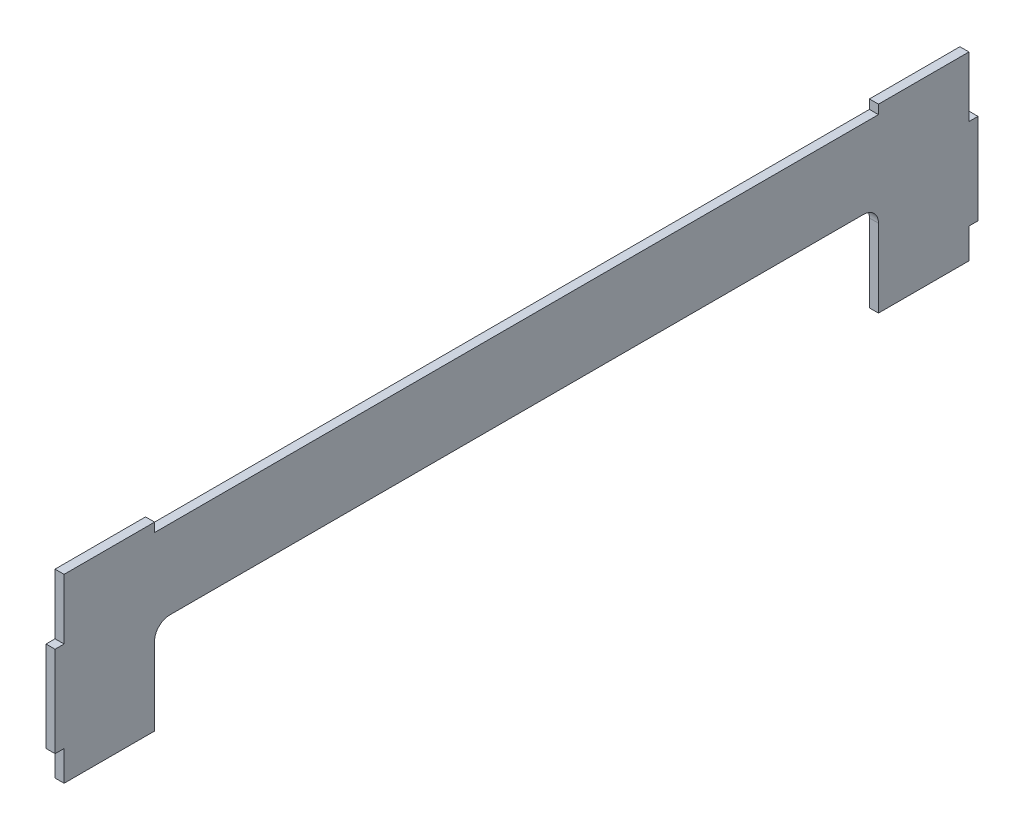
ISO-10303-21;
HEADER;
FILE_DESCRIPTION(('STEP AP214'),'2;1');
FILE_NAME('part.step','',(''),(''),'','','');
FILE_SCHEMA(('AUTOMOTIVE_DESIGN { 1 0 10303 214 1 1 1 1 }'));
ENDSEC;
DATA;
#1=APPLICATION_CONTEXT('core data for automotive mechanical design processes');
#2=APPLICATION_PROTOCOL_DEFINITION('international standard','automotive_design',2000,#1);
#3=PRODUCT_CONTEXT('',#1,'mechanical');
#4=PRODUCT('Part','Part','',(#3));
#5=PRODUCT_RELATED_PRODUCT_CATEGORY('part','',(#4));
#6=PRODUCT_DEFINITION_FORMATION('','',#4);
#7=PRODUCT_DEFINITION_CONTEXT('part definition',#1,'design');
#8=PRODUCT_DEFINITION('design','',#6,#7);
#9=PRODUCT_DEFINITION_SHAPE('','',#8);
#10=(LENGTH_UNIT() NAMED_UNIT(*) SI_UNIT(.MILLI.,.METRE.));
#11=(NAMED_UNIT(*) PLANE_ANGLE_UNIT() SI_UNIT($,.RADIAN.));
#12=(NAMED_UNIT(*) SI_UNIT($,.STERADIAN.) SOLID_ANGLE_UNIT());
#13=UNCERTAINTY_MEASURE_WITH_UNIT(LENGTH_MEASURE(1.E-05),#10,'distance_accuracy_value','');
#14=(GEOMETRIC_REPRESENTATION_CONTEXT(3) GLOBAL_UNCERTAINTY_ASSIGNED_CONTEXT((#13)) GLOBAL_UNIT_ASSIGNED_CONTEXT((#10,
#11,#12)) REPRESENTATION_CONTEXT('',''));
#15=CARTESIAN_POINT('',(0.,0.,0.));
#16=DIRECTION('',(0.,0.,1.));
#17=DIRECTION('',(1.,0.,0.));
#18=AXIS2_PLACEMENT_3D('',#15,#16,#17);
#19=CARTESIAN_POINT('',(3.,-9.99999999999998,-130.909090909091));
#20=DIRECTION('',(0.,1.,0.));
#21=DIRECTION('',(0.,0.,1.));
#22=AXIS2_PLACEMENT_3D('',#19,#20,#21);
#23=PLANE('',#22);
#24=DIRECTION('',(0.,0.,-1.));
#25=VECTOR('',#24,1.);
#26=CARTESIAN_POINT('',(0.,-9.99999999999998,-130.909090909091));
#27=LINE('',#26,#25);
#28=CARTESIAN_POINT('',(0.,-10.,169.090909090909));
#29=VERTEX_POINT('',#28);
#30=CARTESIAN_POINT('',(0.,-10.,139.090909090909));
#31=VERTEX_POINT('',#30);
#32=EDGE_CURVE('E192',#29,#31,#27,.T.);
#33=ORIENTED_EDGE('',*,*,#32,.T.);
#34=DIRECTION('',(1.,0.,0.));
#35=VECTOR('',#34,1.);
#36=CARTESIAN_POINT('',(-389.801632243889,-10.,139.090909090909));
#37=LINE('',#36,#35);
#38=CARTESIAN_POINT('',(3.,-10.,139.090909090909));
#39=VERTEX_POINT('',#38);
#40=EDGE_CURVE('E232',#31,#39,#37,.T.);
#41=ORIENTED_EDGE('',*,*,#40,.T.);
#42=DIRECTION('',(0.,0.,-1.));
#43=VECTOR('',#42,1.);
#44=CARTESIAN_POINT('',(3.,-9.99999999999998,-130.909090909091));
#45=LINE('',#44,#43);
#46=CARTESIAN_POINT('',(3.,-10.,169.090909090909));
#47=VERTEX_POINT('',#46);
#48=EDGE_CURVE('E252',#47,#39,#45,.T.);
#49=ORIENTED_EDGE('',*,*,#48,.F.);
#50=DIRECTION('',(-1.,0.,0.));
#51=VECTOR('',#50,1.);
#52=CARTESIAN_POINT('',(3.,-10.,169.090909090909));
#53=LINE('',#52,#51);
#54=EDGE_CURVE('E331',#47,#29,#53,.T.);
#55=ORIENTED_EDGE('',*,*,#54,.T.);
#56=EDGE_LOOP('',(#33,#41,#49,#55));
#57=FACE_BOUND('',#56,.T.);
#58=ADVANCED_FACE('F33',(#57),#23,.F.);
#59=CARTESIAN_POINT('',(3.,30.,169.090909090909));
#60=DIRECTION('',(0.,0.,-1.));
#61=DIRECTION('',(-1.,0.,0.));
#62=AXIS2_PLACEMENT_3D('',#59,#60,#61);
#63=PLANE('',#62);
#64=DIRECTION('',(0.,-1.,0.));
#65=VECTOR('',#64,1.);
#66=CARTESIAN_POINT('',(0.,30.,169.090909090909));
#67=LINE('',#66,#65);
#68=CARTESIAN_POINT('',(0.,50.,169.090909090909));
#69=VERTEX_POINT('',#68);
#70=CARTESIAN_POINT('',(0.,30.,169.090909090909));
#71=VERTEX_POINT('',#70);
#72=EDGE_CURVE('E206',#69,#71,#67,.T.);
#73=ORIENTED_EDGE('',*,*,#72,.T.);
#74=DIRECTION('',(-1.,0.,0.));
#75=VECTOR('',#74,1.);
#76=CARTESIAN_POINT('',(3.,30.,169.090909090909));
#77=LINE('',#76,#75);
#78=CARTESIAN_POINT('',(3.,30.,169.090909090909));
#79=VERTEX_POINT('',#78);
#80=EDGE_CURVE('E11',#79,#71,#77,.T.);
#81=ORIENTED_EDGE('',*,*,#80,.F.);
#82=DIRECTION('',(0.,-1.,0.));
#83=VECTOR('',#82,1.);
#84=CARTESIAN_POINT('',(3.,30.,169.090909090909));
#85=LINE('',#84,#83);
#86=CARTESIAN_POINT('',(3.,50.,169.090909090909));
#87=VERTEX_POINT('',#86);
#88=EDGE_CURVE('E240',#87,#79,#85,.T.);
#89=ORIENTED_EDGE('',*,*,#88,.F.);
#90=DIRECTION('',(-1.,0.,0.));
#91=VECTOR('',#90,1.);
#92=CARTESIAN_POINT('',(3.,50.,169.090909090909));
#93=LINE('',#92,#91);
#94=EDGE_CURVE('E273',#87,#69,#93,.T.);
#95=ORIENTED_EDGE('',*,*,#94,.T.);
#96=EDGE_LOOP('',(#73,#81,#89,#95));
#97=FACE_BOUND('',#96,.T.);
#98=ADVANCED_FACE('F35',(#97),#63,.F.);
#99=CARTESIAN_POINT('',(3.,30.,172.090909090909));
#100=DIRECTION('',(0.,-1.,0.));
#101=DIRECTION('',(0.,0.,-1.));
#102=AXIS2_PLACEMENT_3D('',#99,#100,#101);
#103=PLANE('',#102);
#104=DIRECTION('',(0.,0.,1.));
#105=VECTOR('',#104,1.);
#106=CARTESIAN_POINT('',(0.,30.,172.090909090909));
#107=LINE('',#106,#105);
#108=CARTESIAN_POINT('',(0.,30.,172.090909090909));
#109=VERTEX_POINT('',#108);
#110=EDGE_CURVE('E210',#71,#109,#107,.T.);
#111=ORIENTED_EDGE('',*,*,#110,.T.);
#112=DIRECTION('',(-1.,0.,0.));
#113=VECTOR('',#112,1.);
#114=CARTESIAN_POINT('',(3.,30.,172.090909090909));
#115=LINE('',#114,#113);
#116=CARTESIAN_POINT('',(3.,30.,172.090909090909));
#117=VERTEX_POINT('',#116);
#118=EDGE_CURVE('E41',#117,#109,#115,.T.);
#119=ORIENTED_EDGE('',*,*,#118,.F.);
#120=DIRECTION('',(0.,0.,1.));
#121=VECTOR('',#120,1.);
#122=CARTESIAN_POINT('',(3.,30.,172.090909090909));
#123=LINE('',#122,#121);
#124=EDGE_CURVE('E243',#79,#117,#123,.T.);
#125=ORIENTED_EDGE('',*,*,#124,.F.);
#126=ORIENTED_EDGE('',*,*,#80,.T.);
#127=EDGE_LOOP('',(#111,#119,#125,#126));
#128=FACE_BOUND('',#127,.T.);
#129=ADVANCED_FACE('F363',(#128),#103,.F.);
#130=CARTESIAN_POINT('',(3.,0.,172.090909090909));
#131=DIRECTION('',(0.,0.,-1.));
#132=DIRECTION('',(0.,1.,0.));
#133=AXIS2_PLACEMENT_3D('',#130,#131,#132);
#134=PLANE('',#133);
#135=DIRECTION('',(0.,-1.,0.));
#136=VECTOR('',#135,1.);
#137=CARTESIAN_POINT('',(0.,0.,172.090909090909));
#138=LINE('',#137,#136);
#139=CARTESIAN_POINT('',(0.,0.,172.090909090909));
#140=VERTEX_POINT('',#139);
#141=EDGE_CURVE('E276',#109,#140,#138,.T.);
#142=ORIENTED_EDGE('',*,*,#141,.T.);
#143=DIRECTION('',(-1.,0.,0.));
#144=VECTOR('',#143,1.);
#145=CARTESIAN_POINT('',(3.,0.,172.090909090909));
#146=LINE('',#145,#144);
#147=CARTESIAN_POINT('',(3.,0.,172.090909090909));
#148=VERTEX_POINT('',#147);
#149=EDGE_CURVE('E337',#148,#140,#146,.T.);
#150=ORIENTED_EDGE('',*,*,#149,.F.);
#151=DIRECTION('',(0.,-1.,0.));
#152=VECTOR('',#151,1.);
#153=CARTESIAN_POINT('',(3.,0.,172.090909090909));
#154=LINE('',#153,#152);
#155=EDGE_CURVE('E246',#117,#148,#154,.T.);
#156=ORIENTED_EDGE('',*,*,#155,.F.);
#157=ORIENTED_EDGE('',*,*,#118,.T.);
#158=EDGE_LOOP('',(#142,#150,#156,#157));
#159=FACE_BOUND('',#158,.T.);
#160=ADVANCED_FACE('F344',(#159),#134,.F.);
#161=CARTESIAN_POINT('',(3.,0.,169.090909090909));
#162=DIRECTION('',(0.,1.,0.));
#163=DIRECTION('',(0.,0.,1.));
#164=AXIS2_PLACEMENT_3D('',#161,#162,#163);
#165=PLANE('',#164);
#166=DIRECTION('',(0.,0.,-1.));
#167=VECTOR('',#166,1.);
#168=CARTESIAN_POINT('',(0.,0.,169.090909090909));
#169=LINE('',#168,#167);
#170=CARTESIAN_POINT('',(0.,0.,169.090909090909));
#171=VERTEX_POINT('',#170);
#172=EDGE_CURVE('E278',#140,#171,#169,.T.);
#173=ORIENTED_EDGE('',*,*,#172,.T.);
#174=DIRECTION('',(-1.,0.,0.));
#175=VECTOR('',#174,1.);
#176=CARTESIAN_POINT('',(3.,0.,169.090909090909));
#177=LINE('',#176,#175);
#178=CARTESIAN_POINT('',(3.,0.,169.090909090909));
#179=VERTEX_POINT('',#178);
#180=EDGE_CURVE('E334',#179,#171,#177,.T.);
#181=ORIENTED_EDGE('',*,*,#180,.F.);
#182=DIRECTION('',(0.,0.,-1.));
#183=VECTOR('',#182,1.);
#184=CARTESIAN_POINT('',(3.,0.,169.090909090909));
#185=LINE('',#184,#183);
#186=EDGE_CURVE('E248',#148,#179,#185,.T.);
#187=ORIENTED_EDGE('',*,*,#186,.F.);
#188=ORIENTED_EDGE('',*,*,#149,.T.);
#189=EDGE_LOOP('',(#173,#181,#187,#188));
#190=FACE_BOUND('',#189,.T.);
#191=ADVANCED_FACE('F353',(#190),#165,.F.);
#192=CARTESIAN_POINT('',(3.,-10.,169.090909090909));
#193=DIRECTION('',(0.,0.,-1.));
#194=DIRECTION('',(-1.,0.,0.));
#195=AXIS2_PLACEMENT_3D('',#192,#193,#194);
#196=PLANE('',#195);
#197=DIRECTION('',(0.,-1.,0.));
#198=VECTOR('',#197,1.);
#199=CARTESIAN_POINT('',(0.,-10.,169.090909090909));
#200=LINE('',#199,#198);
#201=EDGE_CURVE('E193',#171,#29,#200,.T.);
#202=ORIENTED_EDGE('',*,*,#201,.T.);
#203=ORIENTED_EDGE('',*,*,#54,.F.);
#204=DIRECTION('',(0.,-1.,0.));
#205=VECTOR('',#204,1.);
#206=CARTESIAN_POINT('',(3.,-10.,169.090909090909));
#207=LINE('',#206,#205);
#208=EDGE_CURVE('E250',#179,#47,#207,.T.);
#209=ORIENTED_EDGE('',*,*,#208,.F.);
#210=ORIENTED_EDGE('',*,*,#180,.T.);
#211=EDGE_LOOP('',(#202,#203,#209,#210));
#212=FACE_BOUND('',#211,.T.);
#213=ADVANCED_FACE('F357',(#212),#196,.F.);
#214=CARTESIAN_POINT('',(3.,-9.99999999999999,-100.909090909091));
#215=VERTEX_POINT('',#214);
#216=CARTESIAN_POINT('',(3.,-9.99999999999998,-130.909090909091));
#217=VERTEX_POINT('',#216);
#218=EDGE_CURVE('E199',#215,#217,#45,.T.);
#219=ORIENTED_EDGE('',*,*,#218,.F.);
#220=DIRECTION('',(1.,0.,0.));
#221=VECTOR('',#220,1.);
#222=CARTESIAN_POINT('',(-389.801632243889,-10.,-100.909090909091));
#223=LINE('',#222,#221);
#224=CARTESIAN_POINT('',(0.,-10.,-100.909090909091));
#225=VERTEX_POINT('',#224);
#226=EDGE_CURVE('E197',#225,#215,#223,.T.);
#227=ORIENTED_EDGE('',*,*,#226,.F.);
#228=CARTESIAN_POINT('',(0.,-9.99999999999998,-130.909090909091));
#229=VERTEX_POINT('',#228);
#230=EDGE_CURVE('E181',#225,#229,#27,.T.);
#231=ORIENTED_EDGE('',*,*,#230,.T.);
#232=DIRECTION('',(-1.,0.,0.));
#233=VECTOR('',#232,1.);
#234=CARTESIAN_POINT('',(3.,-9.99999999999998,-130.909090909091));
#235=LINE('',#234,#233);
#236=EDGE_CURVE('E329',#217,#229,#235,.T.);
#237=ORIENTED_EDGE('',*,*,#236,.F.);
#238=EDGE_LOOP('',(#219,#227,#231,#237));
#239=FACE_BOUND('',#238,.T.);
#240=ADVANCED_FACE('F198',(#239),#23,.F.);
#241=CARTESIAN_POINT('',(3.,0.,-130.909090909091));
#242=DIRECTION('',(0.,0.,1.));
#243=DIRECTION('',(1.,0.,0.));
#244=AXIS2_PLACEMENT_3D('',#241,#242,#243);
#245=PLANE('',#244);
#246=DIRECTION('',(0.,1.,0.));
#247=VECTOR('',#246,1.);
#248=CARTESIAN_POINT('',(0.,0.,-130.909090909091));
#249=LINE('',#248,#247);
#250=CARTESIAN_POINT('',(0.,0.,-130.909090909091));
#251=VERTEX_POINT('',#250);
#252=EDGE_CURVE('E188',#229,#251,#249,.T.);
#253=ORIENTED_EDGE('',*,*,#252,.T.);
#254=DIRECTION('',(-1.,0.,0.));
#255=VECTOR('',#254,1.);
#256=CARTESIAN_POINT('',(3.,0.,-130.909090909091));
#257=LINE('',#256,#255);
#258=CARTESIAN_POINT('',(3.,0.,-130.909090909091));
#259=VERTEX_POINT('',#258);
#260=EDGE_CURVE('E326',#259,#251,#257,.T.);
#261=ORIENTED_EDGE('',*,*,#260,.F.);
#262=DIRECTION('',(0.,1.,0.));
#263=VECTOR('',#262,1.);
#264=CARTESIAN_POINT('',(3.,0.,-130.909090909091));
#265=LINE('',#264,#263);
#266=EDGE_CURVE('E254',#217,#259,#265,.T.);
#267=ORIENTED_EDGE('',*,*,#266,.F.);
#268=ORIENTED_EDGE('',*,*,#236,.T.);
#269=EDGE_LOOP('',(#253,#261,#267,#268));
#270=FACE_BOUND('',#269,.T.);
#271=ADVANCED_FACE('F412',(#270),#245,.F.);
#272=CARTESIAN_POINT('',(3.,0.,-133.909090909091));
#273=DIRECTION('',(0.,1.,0.));
#274=DIRECTION('',(0.,0.,1.));
#275=AXIS2_PLACEMENT_3D('',#272,#273,#274);
#276=PLANE('',#275);
#277=DIRECTION('',(0.,0.,-1.));
#278=VECTOR('',#277,1.);
#279=CARTESIAN_POINT('',(0.,0.,-133.909090909091));
#280=LINE('',#279,#278);
#281=CARTESIAN_POINT('',(0.,0.,-133.909090909091));
#282=VERTEX_POINT('',#281);
#283=EDGE_CURVE('E283',#251,#282,#280,.T.);
#284=ORIENTED_EDGE('',*,*,#283,.T.);
#285=DIRECTION('',(-1.,0.,0.));
#286=VECTOR('',#285,1.);
#287=CARTESIAN_POINT('',(3.,0.,-133.909090909091));
#288=LINE('',#287,#286);
#289=CARTESIAN_POINT('',(3.,0.,-133.909090909091));
#290=VERTEX_POINT('',#289);
#291=EDGE_CURVE('E323',#290,#282,#288,.T.);
#292=ORIENTED_EDGE('',*,*,#291,.F.);
#293=DIRECTION('',(0.,0.,-1.));
#294=VECTOR('',#293,1.);
#295=CARTESIAN_POINT('',(3.,0.,-133.909090909091));
#296=LINE('',#295,#294);
#297=EDGE_CURVE('E256',#259,#290,#296,.T.);
#298=ORIENTED_EDGE('',*,*,#297,.F.);
#299=ORIENTED_EDGE('',*,*,#260,.T.);
#300=EDGE_LOOP('',(#284,#292,#298,#299));
#301=FACE_BOUND('',#300,.T.);
#302=ADVANCED_FACE('F408',(#301),#276,.F.);
#303=CARTESIAN_POINT('',(3.,30.,-133.909090909091));
#304=DIRECTION('',(0.,0.,1.));
#305=DIRECTION('',(0.,-1.,0.));
#306=AXIS2_PLACEMENT_3D('',#303,#304,#305);
#307=PLANE('',#306);
#308=DIRECTION('',(0.,1.,0.));
#309=VECTOR('',#308,1.);
#310=CARTESIAN_POINT('',(0.,30.,-133.909090909091));
#311=LINE('',#310,#309);
#312=CARTESIAN_POINT('',(0.,30.,-133.909090909091));
#313=VERTEX_POINT('',#312);
#314=EDGE_CURVE('E285',#282,#313,#311,.T.);
#315=ORIENTED_EDGE('',*,*,#314,.T.);
#316=DIRECTION('',(-1.,0.,0.));
#317=VECTOR('',#316,1.);
#318=CARTESIAN_POINT('',(3.,30.,-133.909090909091));
#319=LINE('',#318,#317);
#320=CARTESIAN_POINT('',(3.,30.,-133.909090909091));
#321=VERTEX_POINT('',#320);
#322=EDGE_CURVE('E320',#321,#313,#319,.T.);
#323=ORIENTED_EDGE('',*,*,#322,.F.);
#324=DIRECTION('',(0.,1.,0.));
#325=VECTOR('',#324,1.);
#326=CARTESIAN_POINT('',(3.,30.,-133.909090909091));
#327=LINE('',#326,#325);
#328=EDGE_CURVE('E258',#290,#321,#327,.T.);
#329=ORIENTED_EDGE('',*,*,#328,.F.);
#330=ORIENTED_EDGE('',*,*,#291,.T.);
#331=EDGE_LOOP('',(#315,#323,#329,#330));
#332=FACE_BOUND('',#331,.T.);
#333=ADVANCED_FACE('F404',(#332),#307,.F.);
#334=CARTESIAN_POINT('',(3.,30.,-130.909090909091));
#335=DIRECTION('',(0.,-1.,0.));
#336=DIRECTION('',(0.,0.,-1.));
#337=AXIS2_PLACEMENT_3D('',#334,#335,#336);
#338=PLANE('',#337);
#339=DIRECTION('',(0.,0.,1.));
#340=VECTOR('',#339,1.);
#341=CARTESIAN_POINT('',(0.,30.,-130.909090909091));
#342=LINE('',#341,#340);
#343=CARTESIAN_POINT('',(0.,30.,-130.909090909091));
#344=VERTEX_POINT('',#343);
#345=EDGE_CURVE('E287',#313,#344,#342,.T.);
#346=ORIENTED_EDGE('',*,*,#345,.T.);
#347=DIRECTION('',(-1.,0.,0.));
#348=VECTOR('',#347,1.);
#349=CARTESIAN_POINT('',(3.,30.,-130.909090909091));
#350=LINE('',#349,#348);
#351=CARTESIAN_POINT('',(3.,30.,-130.909090909091));
#352=VERTEX_POINT('',#351);
#353=EDGE_CURVE('E317',#352,#344,#350,.T.);
#354=ORIENTED_EDGE('',*,*,#353,.F.);
#355=DIRECTION('',(0.,0.,1.));
#356=VECTOR('',#355,1.);
#357=CARTESIAN_POINT('',(3.,30.,-130.909090909091));
#358=LINE('',#357,#356);
#359=EDGE_CURVE('E260',#321,#352,#358,.T.);
#360=ORIENTED_EDGE('',*,*,#359,.F.);
#361=ORIENTED_EDGE('',*,*,#322,.T.);
#362=EDGE_LOOP('',(#346,#354,#360,#361));
#363=FACE_BOUND('',#362,.T.);
#364=ADVANCED_FACE('F399',(#363),#338,.F.);
#365=CARTESIAN_POINT('',(3.,50.,-130.909090909091));
#366=DIRECTION('',(0.,0.,1.));
#367=DIRECTION('',(1.,0.,0.));
#368=AXIS2_PLACEMENT_3D('',#365,#366,#367);
#369=PLANE('',#368);
#370=DIRECTION('',(0.,1.,0.));
#371=VECTOR('',#370,1.);
#372=CARTESIAN_POINT('',(0.,50.,-130.909090909091));
#373=LINE('',#372,#371);
#374=CARTESIAN_POINT('',(0.,50.,-130.909090909091));
#375=VERTEX_POINT('',#374);
#376=EDGE_CURVE('E289',#344,#375,#373,.T.);
#377=ORIENTED_EDGE('',*,*,#376,.T.);
#378=DIRECTION('',(-1.,0.,0.));
#379=VECTOR('',#378,1.);
#380=CARTESIAN_POINT('',(3.,50.,-130.909090909091));
#381=LINE('',#380,#379);
#382=CARTESIAN_POINT('',(3.,50.,-130.909090909091));
#383=VERTEX_POINT('',#382);
#384=EDGE_CURVE('E314',#383,#375,#381,.T.);
#385=ORIENTED_EDGE('',*,*,#384,.F.);
#386=DIRECTION('',(0.,1.,0.));
#387=VECTOR('',#386,1.);
#388=CARTESIAN_POINT('',(3.,50.,-130.909090909091));
#389=LINE('',#388,#387);
#390=EDGE_CURVE('E262',#352,#383,#389,.T.);
#391=ORIENTED_EDGE('',*,*,#390,.F.);
#392=ORIENTED_EDGE('',*,*,#353,.T.);
#393=EDGE_LOOP('',(#377,#385,#391,#392));
#394=FACE_BOUND('',#393,.T.);
#395=ADVANCED_FACE('F394',(#394),#369,.F.);
#396=CARTESIAN_POINT('',(3.,50.,-100.909090909091));
#397=DIRECTION('',(0.,-1.,0.));
#398=DIRECTION('',(0.,0.,-1.));
#399=AXIS2_PLACEMENT_3D('',#396,#397,#398);
#400=PLANE('',#399);
#401=DIRECTION('',(0.,0.,1.));
#402=VECTOR('',#401,1.);
#403=CARTESIAN_POINT('',(0.,50.,-100.909090909091));
#404=LINE('',#403,#402);
#405=CARTESIAN_POINT('',(0.,50.,-100.909090909091));
#406=VERTEX_POINT('',#405);
#407=EDGE_CURVE('E291',#375,#406,#404,.T.);
#408=ORIENTED_EDGE('',*,*,#407,.T.);
#409=DIRECTION('',(-1.,0.,0.));
#410=VECTOR('',#409,1.);
#411=CARTESIAN_POINT('',(3.,50.,-100.909090909091));
#412=LINE('',#411,#410);
#413=CARTESIAN_POINT('',(3.,50.,-100.909090909091));
#414=VERTEX_POINT('',#413);
#415=EDGE_CURVE('E311',#414,#406,#412,.T.);
#416=ORIENTED_EDGE('',*,*,#415,.F.);
#417=DIRECTION('',(0.,0.,1.));
#418=VECTOR('',#417,1.);
#419=CARTESIAN_POINT('',(3.,50.,-100.909090909091));
#420=LINE('',#419,#418);
#421=EDGE_CURVE('E264',#383,#414,#420,.T.);
#422=ORIENTED_EDGE('',*,*,#421,.F.);
#423=ORIENTED_EDGE('',*,*,#384,.T.);
#424=EDGE_LOOP('',(#408,#416,#422,#423));
#425=FACE_BOUND('',#424,.T.);
#426=ADVANCED_FACE('F390',(#425),#400,.F.);
#427=CARTESIAN_POINT('',(3.,47.,-100.909090909091));
#428=DIRECTION('',(0.,0.,-1.));
#429=DIRECTION('',(-1.,0.,0.));
#430=AXIS2_PLACEMENT_3D('',#427,#428,#429);
#431=PLANE('',#430);
#432=DIRECTION('',(0.,-1.,0.));
#433=VECTOR('',#432,1.);
#434=CARTESIAN_POINT('',(0.,47.,-100.909090909091));
#435=LINE('',#434,#433);
#436=CARTESIAN_POINT('',(0.,47.,-100.909090909091));
#437=VERTEX_POINT('',#436);
#438=EDGE_CURVE('E293',#406,#437,#435,.T.);
#439=ORIENTED_EDGE('',*,*,#438,.T.);
#440=DIRECTION('',(-1.,0.,0.));
#441=VECTOR('',#440,1.);
#442=CARTESIAN_POINT('',(3.,47.,-100.909090909091));
#443=LINE('',#442,#441);
#444=CARTESIAN_POINT('',(3.,47.,-100.909090909091));
#445=VERTEX_POINT('',#444);
#446=EDGE_CURVE('E308',#445,#437,#443,.T.);
#447=ORIENTED_EDGE('',*,*,#446,.F.);
#448=DIRECTION('',(0.,-1.,0.));
#449=VECTOR('',#448,1.);
#450=CARTESIAN_POINT('',(3.,47.,-100.909090909091));
#451=LINE('',#450,#449);
#452=EDGE_CURVE('E266',#414,#445,#451,.T.);
#453=ORIENTED_EDGE('',*,*,#452,.F.);
#454=ORIENTED_EDGE('',*,*,#415,.T.);
#455=EDGE_LOOP('',(#439,#447,#453,#454));
#456=FACE_BOUND('',#455,.T.);
#457=ADVANCED_FACE('F385',(#456),#431,.F.);
#458=CARTESIAN_POINT('',(3.,47.,139.090909090909));
#459=DIRECTION('',(0.,-1.,0.));
#460=DIRECTION('',(0.,0.,-1.));
#461=AXIS2_PLACEMENT_3D('',#458,#459,#460);
#462=PLANE('',#461);
#463=DIRECTION('',(0.,0.,1.));
#464=VECTOR('',#463,1.);
#465=CARTESIAN_POINT('',(0.,47.,139.090909090909));
#466=LINE('',#465,#464);
#467=CARTESIAN_POINT('',(0.,47.,139.090909090909));
#468=VERTEX_POINT('',#467);
#469=EDGE_CURVE('E295',#437,#468,#466,.T.);
#470=ORIENTED_EDGE('',*,*,#469,.T.);
#471=DIRECTION('',(-1.,0.,0.));
#472=VECTOR('',#471,1.);
#473=CARTESIAN_POINT('',(3.,47.,139.090909090909));
#474=LINE('',#473,#472);
#475=CARTESIAN_POINT('',(3.,47.,139.090909090909));
#476=VERTEX_POINT('',#475);
#477=EDGE_CURVE('E305',#476,#468,#474,.T.);
#478=ORIENTED_EDGE('',*,*,#477,.F.);
#479=DIRECTION('',(0.,0.,1.));
#480=VECTOR('',#479,1.);
#481=CARTESIAN_POINT('',(3.,47.,139.090909090909));
#482=LINE('',#481,#480);
#483=EDGE_CURVE('E268',#445,#476,#482,.T.);
#484=ORIENTED_EDGE('',*,*,#483,.F.);
#485=ORIENTED_EDGE('',*,*,#446,.T.);
#486=EDGE_LOOP('',(#470,#478,#484,#485));
#487=FACE_BOUND('',#486,.T.);
#488=ADVANCED_FACE('F379',(#487),#462,.F.);
#489=CARTESIAN_POINT('',(3.,50.,139.090909090909));
#490=DIRECTION('',(0.,0.,1.));
#491=DIRECTION('',(1.,0.,0.));
#492=AXIS2_PLACEMENT_3D('',#489,#490,#491);
#493=PLANE('',#492);
#494=DIRECTION('',(0.,1.,0.));
#495=VECTOR('',#494,1.);
#496=CARTESIAN_POINT('',(0.,50.,139.090909090909));
#497=LINE('',#496,#495);
#498=CARTESIAN_POINT('',(0.,50.,139.090909090909));
#499=VERTEX_POINT('',#498);
#500=EDGE_CURVE('E297',#468,#499,#497,.T.);
#501=ORIENTED_EDGE('',*,*,#500,.T.);
#502=DIRECTION('',(-1.,0.,0.));
#503=VECTOR('',#502,1.);
#504=CARTESIAN_POINT('',(3.,50.,139.090909090909));
#505=LINE('',#504,#503);
#506=CARTESIAN_POINT('',(3.,50.,139.090909090909));
#507=VERTEX_POINT('',#506);
#508=EDGE_CURVE('E302',#507,#499,#505,.T.);
#509=ORIENTED_EDGE('',*,*,#508,.F.);
#510=DIRECTION('',(0.,1.,0.));
#511=VECTOR('',#510,1.);
#512=CARTESIAN_POINT('',(3.,50.,139.090909090909));
#513=LINE('',#512,#511);
#514=EDGE_CURVE('E270',#476,#507,#513,.T.);
#515=ORIENTED_EDGE('',*,*,#514,.F.);
#516=ORIENTED_EDGE('',*,*,#477,.T.);
#517=EDGE_LOOP('',(#501,#509,#515,#516));
#518=FACE_BOUND('',#517,.T.);
#519=ADVANCED_FACE('F375',(#518),#493,.F.);
#520=CARTESIAN_POINT('',(3.,50.,169.090909090909));
#521=DIRECTION('',(0.,-1.,0.));
#522=DIRECTION('',(0.,0.,-1.));
#523=AXIS2_PLACEMENT_3D('',#520,#521,#522);
#524=PLANE('',#523);
#525=DIRECTION('',(0.,0.,1.));
#526=VECTOR('',#525,1.);
#527=CARTESIAN_POINT('',(0.,50.,169.090909090909));
#528=LINE('',#527,#526);
#529=EDGE_CURVE('E244',#499,#69,#528,.T.);
#530=ORIENTED_EDGE('',*,*,#529,.T.);
#531=ORIENTED_EDGE('',*,*,#94,.F.);
#532=DIRECTION('',(0.,0.,1.));
#533=VECTOR('',#532,1.);
#534=CARTESIAN_POINT('',(3.,50.,169.090909090909));
#535=LINE('',#534,#533);
#536=EDGE_CURVE('E272',#507,#87,#535,.T.);
#537=ORIENTED_EDGE('',*,*,#536,.F.);
#538=ORIENTED_EDGE('',*,*,#508,.T.);
#539=EDGE_LOOP('',(#530,#531,#537,#538));
#540=FACE_BOUND('',#539,.T.);
#541=ADVANCED_FACE('F370',(#540),#524,.F.);
#542=CARTESIAN_POINT('',(3.,0.,0.));
#543=DIRECTION('',(-1.,0.,0.));
#544=DIRECTION('',(0.,0.,1.));
#545=AXIS2_PLACEMENT_3D('',#542,#543,#544);
#546=PLANE('',#545);
#547=CARTESIAN_POINT('',(3.,15.8189537556352,-95.9090909090909));
#548=DIRECTION('',(-1.,0.,0.));
#549=DIRECTION('',(0.,0.,1.));
#550=AXIS2_PLACEMENT_3D('',#547,#548,#549);
#551=CIRCLE('',#550,5.);
#552=CARTESIAN_POINT('',(3.,15.8189537556351,-100.909090909091));
#553=VERTEX_POINT('',#552);
#554=CARTESIAN_POINT('',(3.,20.8189537556352,-95.9090909090909));
#555=VERTEX_POINT('',#554);
#556=EDGE_CURVE('E48',#553,#555,#551,.F.);
#557=ORIENTED_EDGE('',*,*,#556,.F.);
#558=DIRECTION('',(0.,1.,0.));
#559=VECTOR('',#558,1.);
#560=CARTESIAN_POINT('',(3.,-10.,-100.909090909091));
#561=LINE('',#560,#559);
#562=EDGE_CURVE('E216',#215,#553,#561,.T.);
#563=ORIENTED_EDGE('',*,*,#562,.F.);
#564=ORIENTED_EDGE('',*,*,#218,.T.);
#565=ORIENTED_EDGE('',*,*,#266,.T.);
#566=ORIENTED_EDGE('',*,*,#297,.T.);
#567=ORIENTED_EDGE('',*,*,#328,.T.);
#568=ORIENTED_EDGE('',*,*,#359,.T.);
#569=ORIENTED_EDGE('',*,*,#390,.T.);
#570=ORIENTED_EDGE('',*,*,#421,.T.);
#571=ORIENTED_EDGE('',*,*,#452,.T.);
#572=ORIENTED_EDGE('',*,*,#483,.T.);
#573=ORIENTED_EDGE('',*,*,#514,.T.);
#574=ORIENTED_EDGE('',*,*,#536,.T.);
#575=ORIENTED_EDGE('',*,*,#88,.T.);
#576=ORIENTED_EDGE('',*,*,#124,.T.);
#577=ORIENTED_EDGE('',*,*,#155,.T.);
#578=ORIENTED_EDGE('',*,*,#186,.T.);
#579=ORIENTED_EDGE('',*,*,#208,.T.);
#580=ORIENTED_EDGE('',*,*,#48,.T.);
#581=DIRECTION('',(0.,-1.,0.));
#582=VECTOR('',#581,1.);
#583=CARTESIAN_POINT('',(3.,15.8189537556351,139.090909090909));
#584=LINE('',#583,#582);
#585=CARTESIAN_POINT('',(3.,15.8189537556351,139.090909090909));
#586=VERTEX_POINT('',#585);
#587=EDGE_CURVE('E55',#586,#39,#584,.T.);
#588=ORIENTED_EDGE('',*,*,#587,.F.);
#589=CARTESIAN_POINT('',(3.,15.8189537556352,134.090909090909));
#590=DIRECTION('',(-1.,0.,0.));
#591=DIRECTION('',(0.,0.,1.));
#592=AXIS2_PLACEMENT_3D('',#589,#590,#591);
#593=CIRCLE('',#592,5.);
#594=CARTESIAN_POINT('',(3.,20.8189537556352,134.090909090909));
#595=VERTEX_POINT('',#594);
#596=EDGE_CURVE('E222',#595,#586,#593,.F.);
#597=ORIENTED_EDGE('',*,*,#596,.F.);
#598=DIRECTION('',(0.,0.,1.));
#599=VECTOR('',#598,1.);
#600=CARTESIAN_POINT('',(3.,20.8189537556352,-95.9090909090909));
#601=LINE('',#600,#599);
#602=EDGE_CURVE('E219',#555,#595,#601,.T.);
#603=ORIENTED_EDGE('',*,*,#602,.F.);
#604=EDGE_LOOP('',(#557,#563,#564,#565,#566,#567,#568,#569,#570,#571,#572,#573,#574,#575,#576,
#577,#578,#579,#580,#588,#597,#603));
#605=FACE_BOUND('',#604,.T.);
#606=ADVANCED_FACE('F360',(#605),#546,.F.);
#607=CARTESIAN_POINT('',(0.,0.,0.));
#608=DIRECTION('',(-1.,0.,0.));
#609=DIRECTION('',(0.,0.,1.));
#610=AXIS2_PLACEMENT_3D('',#607,#608,#609);
#611=PLANE('',#610);
#612=DIRECTION('',(0.,-1.,0.));
#613=VECTOR('',#612,1.);
#614=CARTESIAN_POINT('',(0.,15.8189537556351,139.090909090909));
#615=LINE('',#614,#613);
#616=CARTESIAN_POINT('',(0.,15.8189537556352,139.090909090909));
#617=VERTEX_POINT('',#616);
#618=EDGE_CURVE('E237',#617,#31,#615,.T.);
#619=ORIENTED_EDGE('',*,*,#618,.T.);
#620=ORIENTED_EDGE('',*,*,#32,.F.);
#621=ORIENTED_EDGE('',*,*,#201,.F.);
#622=ORIENTED_EDGE('',*,*,#172,.F.);
#623=ORIENTED_EDGE('',*,*,#141,.F.);
#624=ORIENTED_EDGE('',*,*,#110,.F.);
#625=ORIENTED_EDGE('',*,*,#72,.F.);
#626=ORIENTED_EDGE('',*,*,#529,.F.);
#627=ORIENTED_EDGE('',*,*,#500,.F.);
#628=ORIENTED_EDGE('',*,*,#469,.F.);
#629=ORIENTED_EDGE('',*,*,#438,.F.);
#630=ORIENTED_EDGE('',*,*,#407,.F.);
#631=ORIENTED_EDGE('',*,*,#376,.F.);
#632=ORIENTED_EDGE('',*,*,#345,.F.);
#633=ORIENTED_EDGE('',*,*,#314,.F.);
#634=ORIENTED_EDGE('',*,*,#283,.F.);
#635=ORIENTED_EDGE('',*,*,#252,.F.);
#636=ORIENTED_EDGE('',*,*,#230,.F.);
#637=DIRECTION('',(0.,1.,0.));
#638=VECTOR('',#637,1.);
#639=CARTESIAN_POINT('',(0.,-10.,-100.909090909091));
#640=LINE('',#639,#638);
#641=CARTESIAN_POINT('',(0.,15.8189537556351,-100.909090909091));
#642=VERTEX_POINT('',#641);
#643=EDGE_CURVE('E185',#225,#642,#640,.T.);
#644=ORIENTED_EDGE('',*,*,#643,.T.);
#645=CARTESIAN_POINT('',(0.,15.8189537556352,-95.9090909090909));
#646=DIRECTION('',(-1.,0.,0.));
#647=DIRECTION('',(0.,0.,1.));
#648=AXIS2_PLACEMENT_3D('',#645,#646,#647);
#649=CIRCLE('',#648,5.);
#650=CARTESIAN_POINT('',(0.,20.8189537556352,-95.9090909090909));
#651=VERTEX_POINT('',#650);
#652=EDGE_CURVE('E207',#642,#651,#649,.F.);
#653=ORIENTED_EDGE('',*,*,#652,.T.);
#654=DIRECTION('',(0.,0.,1.));
#655=VECTOR('',#654,1.);
#656=CARTESIAN_POINT('',(0.,20.8189537556352,-95.9090909090909));
#657=LINE('',#656,#655);
#658=CARTESIAN_POINT('',(0.,20.8189537556352,134.090909090909));
#659=VERTEX_POINT('',#658);
#660=EDGE_CURVE('E212',#651,#659,#657,.T.);
#661=ORIENTED_EDGE('',*,*,#660,.T.);
#662=CARTESIAN_POINT('',(0.,15.8189537556352,134.090909090909));
#663=DIRECTION('',(-1.,0.,0.));
#664=DIRECTION('',(0.,0.,1.));
#665=AXIS2_PLACEMENT_3D('',#662,#663,#664);
#666=CIRCLE('',#665,5.);
#667=EDGE_CURVE('E239',#659,#617,#666,.F.);
#668=ORIENTED_EDGE('',*,*,#667,.T.);
#669=EDGE_LOOP('',(#619,#620,#621,#622,#623,#624,#625,#626,#627,#628,#629,#630,#631,#632,#633,
#634,#635,#636,#644,#653,#661,#668));
#670=FACE_BOUND('',#669,.T.);
#671=ADVANCED_FACE('F183',(#670),#611,.T.);
#672=CARTESIAN_POINT('',(-389.801632243889,15.8189537556351,139.090909090909));
#673=DIRECTION('',(0.,0.,1.));
#674=DIRECTION('',(1.,0.,0.));
#675=AXIS2_PLACEMENT_3D('',#672,#673,#674);
#676=PLANE('',#675);
#677=DIRECTION('',(1.,0.,0.));
#678=VECTOR('',#677,1.);
#679=CARTESIAN_POINT('',(-389.801632243889,15.8189537556351,139.090909090909));
#680=LINE('',#679,#678);
#681=EDGE_CURVE('E234',#617,#586,#680,.T.);
#682=ORIENTED_EDGE('',*,*,#681,.T.);
#683=ORIENTED_EDGE('',*,*,#587,.T.);
#684=ORIENTED_EDGE('',*,*,#40,.F.);
#685=ORIENTED_EDGE('',*,*,#618,.F.);
#686=EDGE_LOOP('',(#682,#683,#684,#685));
#687=FACE_BOUND('',#686,.T.);
#688=ADVANCED_FACE('F427',(#687),#676,.F.);
#689=CARTESIAN_POINT('',(-389.801632243889,15.8189537556352,134.090909090909));
#690=DIRECTION('',(1.,0.,0.));
#691=DIRECTION('',(0.,0.,-1.));
#692=AXIS2_PLACEMENT_3D('',#689,#690,#691);
#693=CYLINDRICAL_SURFACE('',#692,5.);
#694=DIRECTION('',(1.,0.,0.));
#695=VECTOR('',#694,1.);
#696=CARTESIAN_POINT('',(-389.801632243889,20.8189537556352,134.090909090909));
#697=LINE('',#696,#695);
#698=EDGE_CURVE('E229',#659,#595,#697,.T.);
#699=ORIENTED_EDGE('',*,*,#698,.T.);
#700=ORIENTED_EDGE('',*,*,#596,.T.);
#701=ORIENTED_EDGE('',*,*,#681,.F.);
#702=ORIENTED_EDGE('',*,*,#667,.F.);
#703=EDGE_LOOP('',(#699,#700,#701,#702));
#704=FACE_BOUND('',#703,.T.);
#705=ADVANCED_FACE('F428',(#704),#693,.F.);
#706=CARTESIAN_POINT('',(-389.801632243889,20.8189537556352,-95.9090909090909));
#707=DIRECTION('',(0.,1.,0.));
#708=DIRECTION('',(0.,0.,1.));
#709=AXIS2_PLACEMENT_3D('',#706,#707,#708);
#710=PLANE('',#709);
#711=DIRECTION('',(1.,0.,0.));
#712=VECTOR('',#711,1.);
#713=CARTESIAN_POINT('',(-389.801632243889,20.8189537556352,-95.9090909090909));
#714=LINE('',#713,#712);
#715=EDGE_CURVE('E226',#651,#555,#714,.T.);
#716=ORIENTED_EDGE('',*,*,#715,.T.);
#717=ORIENTED_EDGE('',*,*,#602,.T.);
#718=ORIENTED_EDGE('',*,*,#698,.F.);
#719=ORIENTED_EDGE('',*,*,#660,.F.);
#720=EDGE_LOOP('',(#716,#717,#718,#719));
#721=FACE_BOUND('',#720,.T.);
#722=ADVANCED_FACE('F420',(#721),#710,.F.);
#723=CARTESIAN_POINT('',(-389.801632243889,15.8189537556352,-95.9090909090909));
#724=DIRECTION('',(1.,0.,0.));
#725=DIRECTION('',(0.,0.,-1.));
#726=AXIS2_PLACEMENT_3D('',#723,#724,#725);
#727=CYLINDRICAL_SURFACE('',#726,5.);
#728=DIRECTION('',(1.,0.,0.));
#729=VECTOR('',#728,1.);
#730=CARTESIAN_POINT('',(-389.801632243889,15.8189537556351,-100.909090909091));
#731=LINE('',#730,#729);
#732=EDGE_CURVE('E201',#642,#553,#731,.T.);
#733=ORIENTED_EDGE('',*,*,#732,.T.);
#734=ORIENTED_EDGE('',*,*,#556,.T.);
#735=ORIENTED_EDGE('',*,*,#715,.F.);
#736=ORIENTED_EDGE('',*,*,#652,.F.);
#737=EDGE_LOOP('',(#733,#734,#735,#736));
#738=FACE_BOUND('',#737,.T.);
#739=ADVANCED_FACE('F414',(#738),#727,.F.);
#740=CARTESIAN_POINT('',(-389.801632243889,-10.,-100.909090909091));
#741=DIRECTION('',(0.,0.,-1.));
#742=DIRECTION('',(-1.,0.,0.));
#743=AXIS2_PLACEMENT_3D('',#740,#741,#742);
#744=PLANE('',#743);
#745=ORIENTED_EDGE('',*,*,#226,.T.);
#746=ORIENTED_EDGE('',*,*,#562,.T.);
#747=ORIENTED_EDGE('',*,*,#732,.F.);
#748=ORIENTED_EDGE('',*,*,#643,.F.);
#749=EDGE_LOOP('',(#745,#746,#747,#748));
#750=FACE_BOUND('',#749,.T.);
#751=ADVANCED_FACE('F204',(#750),#744,.F.);
#752=CLOSED_SHELL('',(#58,#98,#129,#160,#191,#213,#240,#271,#302,#333,#364,#395,#426,#457,#488,
#519,#541,#606,#671,#688,#705,#722,#739,#751));
#753=MANIFOLD_SOLID_BREP('B2',#752);
#754=ADVANCED_BREP_SHAPE_REPRESENTATION('',(#18,#753),#14);
#755=SHAPE_DEFINITION_REPRESENTATION(#9,#754);
ENDSEC;
END-ISO-10303-21;
